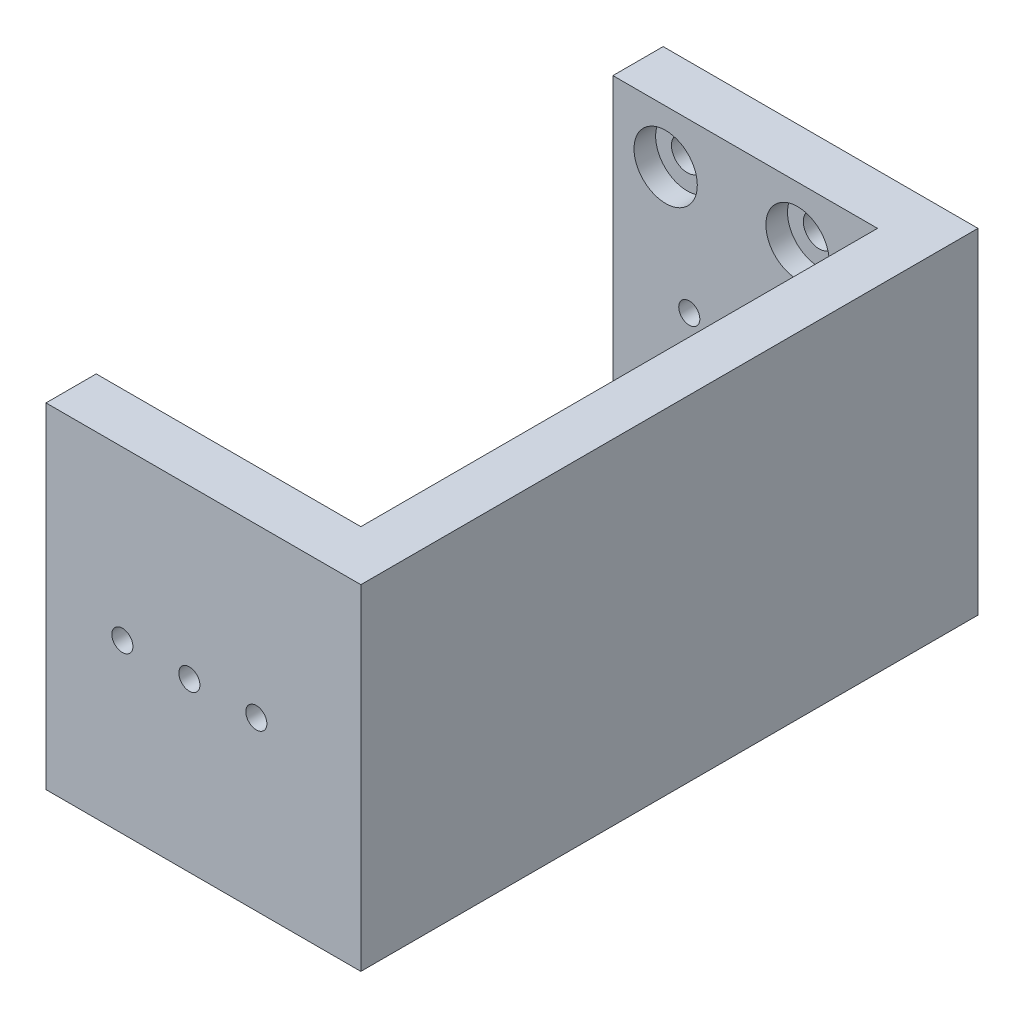
ISO-10303-21;
HEADER;
FILE_DESCRIPTION(('STEP AP214'),'2;1');
FILE_NAME('part.step','',(''),(''),'','','');
FILE_SCHEMA(('AUTOMOTIVE_DESIGN { 1 0 10303 214 1 1 1 1 }'));
ENDSEC;
DATA;
#1=APPLICATION_CONTEXT('core data for automotive mechanical design processes');
#2=APPLICATION_PROTOCOL_DEFINITION('international standard','automotive_design',2000,#1);
#3=PRODUCT_CONTEXT('',#1,'mechanical');
#4=PRODUCT('Part','Part','',(#3));
#5=PRODUCT_RELATED_PRODUCT_CATEGORY('part','',(#4));
#6=PRODUCT_DEFINITION_FORMATION('','',#4);
#7=PRODUCT_DEFINITION_CONTEXT('part definition',#1,'design');
#8=PRODUCT_DEFINITION('design','',#6,#7);
#9=PRODUCT_DEFINITION_SHAPE('','',#8);
#10=(LENGTH_UNIT() NAMED_UNIT(*) SI_UNIT(.MILLI.,.METRE.));
#11=(NAMED_UNIT(*) PLANE_ANGLE_UNIT() SI_UNIT($,.RADIAN.));
#12=(NAMED_UNIT(*) SI_UNIT($,.STERADIAN.) SOLID_ANGLE_UNIT());
#13=UNCERTAINTY_MEASURE_WITH_UNIT(LENGTH_MEASURE(1.E-05),#10,'distance_accuracy_value','');
#14=(GEOMETRIC_REPRESENTATION_CONTEXT(3) GLOBAL_UNCERTAINTY_ASSIGNED_CONTEXT((#13)) GLOBAL_UNIT_ASSIGNED_CONTEXT((#10,
#11,#12)) REPRESENTATION_CONTEXT('',''));
#15=CARTESIAN_POINT('',(0.,0.,0.));
#16=DIRECTION('',(0.,0.,1.));
#17=DIRECTION('',(1.,0.,0.));
#18=AXIS2_PLACEMENT_3D('',#15,#16,#17);
#19=CARTESIAN_POINT('',(-27.178,31.75,117.));
#20=DIRECTION('',(1.,0.,0.));
#21=DIRECTION('',(0.,0.,-1.));
#22=AXIS2_PLACEMENT_3D('',#19,#20,#21);
#23=PLANE('',#22);
#24=DIRECTION('',(0.,0.,-1.));
#25=VECTOR('',#24,1.);
#26=CARTESIAN_POINT('',(-27.178,31.75,117.));
#27=LINE('',#26,#25);
#28=CARTESIAN_POINT('',(-27.178,31.75,117.));
#29=VERTEX_POINT('',#28);
#30=CARTESIAN_POINT('',(-27.178,31.75,107.475));
#31=VERTEX_POINT('',#30);
#32=EDGE_CURVE('E127',#29,#31,#27,.T.);
#33=ORIENTED_EDGE('',*,*,#32,.T.);
#34=DIRECTION('',(0.,-1.,0.));
#35=VECTOR('',#34,1.);
#36=CARTESIAN_POINT('',(-27.178,31.75,107.475));
#37=LINE('',#36,#35);
#38=CARTESIAN_POINT('',(-27.178,-31.75,107.475));
#39=VERTEX_POINT('',#38);
#40=EDGE_CURVE('E142',#31,#39,#37,.T.);
#41=ORIENTED_EDGE('',*,*,#40,.T.);
#42=DIRECTION('',(0.,0.,-1.));
#43=VECTOR('',#42,1.);
#44=CARTESIAN_POINT('',(-27.178,-31.75,117.));
#45=LINE('',#44,#43);
#46=CARTESIAN_POINT('',(-27.178,-31.75,117.));
#47=VERTEX_POINT('',#46);
#48=EDGE_CURVE('E11',#47,#39,#45,.T.);
#49=ORIENTED_EDGE('',*,*,#48,.F.);
#50=DIRECTION('',(0.,-1.,0.));
#51=VECTOR('',#50,1.);
#52=CARTESIAN_POINT('',(-27.178,31.75,117.));
#53=LINE('',#52,#51);
#54=EDGE_CURVE('E185',#29,#47,#53,.T.);
#55=ORIENTED_EDGE('',*,*,#54,.F.);
#56=EDGE_LOOP('',(#33,#41,#49,#55));
#57=FACE_BOUND('',#56,.T.);
#58=ADVANCED_FACE('F34',(#57),#23,.F.);
#59=CARTESIAN_POINT('',(-12.7,0.,117.));
#60=DIRECTION('',(0.,0.,-1.));
#61=DIRECTION('',(-1.,0.,0.));
#62=AXIS2_PLACEMENT_3D('',#59,#60,#61);
#63=CYLINDRICAL_SURFACE('',#62,2.);
#64=CARTESIAN_POINT('',(-12.7,0.,107.475));
#65=DIRECTION('',(0.,0.,1.));
#66=DIRECTION('',(1.,0.,0.));
#67=AXIS2_PLACEMENT_3D('',#64,#65,#66);
#68=CIRCLE('',#67,2.);
#69=CARTESIAN_POINT('',(-10.7,0.,107.475));
#70=VERTEX_POINT('',#69);
#71=EDGE_CURVE('E163',#70,#70,#68,.T.);
#72=ORIENTED_EDGE('',*,*,#71,.F.);
#73=EDGE_LOOP('',(#72));
#74=FACE_BOUND('',#73,.T.);
#75=CARTESIAN_POINT('',(-12.7,0.,117.));
#76=DIRECTION('',(0.,0.,1.));
#77=DIRECTION('',(1.,0.,0.));
#78=AXIS2_PLACEMENT_3D('',#75,#76,#77);
#79=CIRCLE('',#78,2.);
#80=CARTESIAN_POINT('',(-10.7,0.,117.));
#81=VERTEX_POINT('',#80);
#82=EDGE_CURVE('E179',#81,#81,#79,.T.);
#83=ORIENTED_EDGE('',*,*,#82,.T.);
#84=EDGE_LOOP('',(#83));
#85=FACE_BOUND('',#84,.T.);
#86=ADVANCED_FACE('F275',(#74,#85),#63,.F.);
#87=CARTESIAN_POINT('',(0.,0.,117.));
#88=DIRECTION('',(0.,0.,-1.));
#89=DIRECTION('',(-1.,0.,0.));
#90=AXIS2_PLACEMENT_3D('',#87,#88,#89);
#91=CYLINDRICAL_SURFACE('',#90,2.);
#92=CARTESIAN_POINT('',(0.,0.,107.475));
#93=DIRECTION('',(0.,0.,1.));
#94=DIRECTION('',(1.,0.,0.));
#95=AXIS2_PLACEMENT_3D('',#92,#93,#94);
#96=CIRCLE('',#95,2.);
#97=CARTESIAN_POINT('',(2.,0.,107.475));
#98=VERTEX_POINT('',#97);
#99=EDGE_CURVE('E160',#98,#98,#96,.T.);
#100=ORIENTED_EDGE('',*,*,#99,.F.);
#101=EDGE_LOOP('',(#100));
#102=FACE_BOUND('',#101,.T.);
#103=CARTESIAN_POINT('',(0.,0.,117.));
#104=DIRECTION('',(0.,0.,1.));
#105=DIRECTION('',(1.,0.,0.));
#106=AXIS2_PLACEMENT_3D('',#103,#104,#105);
#107=CIRCLE('',#106,2.);
#108=CARTESIAN_POINT('',(2.,0.,117.));
#109=VERTEX_POINT('',#108);
#110=EDGE_CURVE('E173',#109,#109,#107,.T.);
#111=ORIENTED_EDGE('',*,*,#110,.T.);
#112=EDGE_LOOP('',(#111));
#113=FACE_BOUND('',#112,.T.);
#114=ADVANCED_FACE('F279',(#102,#113),#91,.F.);
#115=CARTESIAN_POINT('',(12.7,0.,117.));
#116=DIRECTION('',(0.,0.,-1.));
#117=DIRECTION('',(-1.,0.,0.));
#118=AXIS2_PLACEMENT_3D('',#115,#116,#117);
#119=CYLINDRICAL_SURFACE('',#118,2.);
#120=CARTESIAN_POINT('',(12.7,0.,107.475));
#121=DIRECTION('',(0.,0.,1.));
#122=DIRECTION('',(1.,0.,0.));
#123=AXIS2_PLACEMENT_3D('',#120,#121,#122);
#124=CIRCLE('',#123,2.);
#125=CARTESIAN_POINT('',(14.7,0.,107.475));
#126=VERTEX_POINT('',#125);
#127=EDGE_CURVE('E38',#126,#126,#124,.T.);
#128=ORIENTED_EDGE('',*,*,#127,.F.);
#129=EDGE_LOOP('',(#128));
#130=FACE_BOUND('',#129,.T.);
#131=CARTESIAN_POINT('',(12.7,0.,117.));
#132=DIRECTION('',(0.,0.,1.));
#133=DIRECTION('',(1.,0.,0.));
#134=AXIS2_PLACEMENT_3D('',#131,#132,#133);
#135=CIRCLE('',#134,2.);
#136=CARTESIAN_POINT('',(14.7,0.,117.));
#137=VERTEX_POINT('',#136);
#138=EDGE_CURVE('E167',#137,#137,#135,.T.);
#139=ORIENTED_EDGE('',*,*,#138,.T.);
#140=EDGE_LOOP('',(#139));
#141=FACE_BOUND('',#140,.T.);
#142=ADVANCED_FACE('F295',(#130,#141),#119,.F.);
#143=CARTESIAN_POINT('',(-27.178,-31.75,117.));
#144=DIRECTION('',(0.,0.,1.));
#145=DIRECTION('',(1.,0.,0.));
#146=AXIS2_PLACEMENT_3D('',#143,#144,#145);
#147=PLANE('',#146);
#148=ORIENTED_EDGE('',*,*,#110,.F.);
#149=EDGE_LOOP('',(#148));
#150=FACE_BOUND('',#149,.T.);
#151=ORIENTED_EDGE('',*,*,#54,.T.);
#152=DIRECTION('',(1.,0.,0.));
#153=VECTOR('',#152,1.);
#154=CARTESIAN_POINT('',(-27.178,-31.75,117.));
#155=LINE('',#154,#153);
#156=CARTESIAN_POINT('',(32.512,-31.75,117.));
#157=VERTEX_POINT('',#156);
#158=EDGE_CURVE('E89',#47,#157,#155,.T.);
#159=ORIENTED_EDGE('',*,*,#158,.T.);
#160=DIRECTION('',(0.,1.,0.));
#161=VECTOR('',#160,1.);
#162=CARTESIAN_POINT('',(32.512,-31.75,117.));
#163=LINE('',#162,#161);
#164=CARTESIAN_POINT('',(32.512,31.75,117.));
#165=VERTEX_POINT('',#164);
#166=EDGE_CURVE('E131',#157,#165,#163,.T.);
#167=ORIENTED_EDGE('',*,*,#166,.T.);
#168=DIRECTION('',(-1.,0.,0.));
#169=VECTOR('',#168,1.);
#170=CARTESIAN_POINT('',(32.512,31.75,117.));
#171=LINE('',#170,#169);
#172=EDGE_CURVE('E60',#165,#29,#171,.T.);
#173=ORIENTED_EDGE('',*,*,#172,.T.);
#174=EDGE_LOOP('',(#151,#159,#167,#173));
#175=FACE_BOUND('',#174,.T.);
#176=ORIENTED_EDGE('',*,*,#82,.F.);
#177=EDGE_LOOP('',(#176));
#178=FACE_BOUND('',#177,.T.);
#179=ORIENTED_EDGE('',*,*,#138,.F.);
#180=EDGE_LOOP('',(#179));
#181=FACE_BOUND('',#180,.T.);
#182=ADVANCED_FACE('F289',(#150,#175,#178,#181),#147,.T.);
#183=CARTESIAN_POINT('',(-27.178,-31.75,0.));
#184=DIRECTION('',(0.,0.,1.));
#185=DIRECTION('',(1.,0.,0.));
#186=AXIS2_PLACEMENT_3D('',#183,#184,#185);
#187=PLANE('',#186);
#188=CARTESIAN_POINT('',(-17.178,-21.75,0.));
#189=DIRECTION('',(0.,0.,1.));
#190=DIRECTION('',(1.,0.,0.));
#191=AXIS2_PLACEMENT_3D('',#188,#189,#190);
#192=CIRCLE('',#191,3.00000000000006);
#193=CARTESIAN_POINT('',(-14.1779999999999,-21.75,0.));
#194=VERTEX_POINT('',#193);
#195=EDGE_CURVE('E257',#194,#194,#192,.T.);
#196=ORIENTED_EDGE('',*,*,#195,.T.);
#197=EDGE_LOOP('',(#196));
#198=FACE_BOUND('',#197,.T.);
#199=CARTESIAN_POINT('',(7.82200000000003,-21.75,0.));
#200=DIRECTION('',(0.,0.,1.));
#201=DIRECTION('',(1.,0.,0.));
#202=AXIS2_PLACEMENT_3D('',#199,#200,#201);
#203=CIRCLE('',#202,3.00000000000005);
#204=CARTESIAN_POINT('',(10.8220000000001,-21.75,0.));
#205=VERTEX_POINT('',#204);
#206=EDGE_CURVE('E251',#205,#205,#203,.T.);
#207=ORIENTED_EDGE('',*,*,#206,.T.);
#208=EDGE_LOOP('',(#207));
#209=FACE_BOUND('',#208,.T.);
#210=CARTESIAN_POINT('',(7.82200000000003,21.75,0.));
#211=DIRECTION('',(0.,0.,1.));
#212=DIRECTION('',(1.,0.,0.));
#213=AXIS2_PLACEMENT_3D('',#210,#211,#212);
#214=CIRCLE('',#213,3.00000000000005);
#215=CARTESIAN_POINT('',(10.8220000000001,21.75,0.));
#216=VERTEX_POINT('',#215);
#217=EDGE_CURVE('E245',#216,#216,#214,.T.);
#218=ORIENTED_EDGE('',*,*,#217,.T.);
#219=EDGE_LOOP('',(#218));
#220=FACE_BOUND('',#219,.T.);
#221=CARTESIAN_POINT('',(-17.178,21.75,0.));
#222=DIRECTION('',(0.,0.,1.));
#223=DIRECTION('',(1.,0.,0.));
#224=AXIS2_PLACEMENT_3D('',#221,#222,#223);
#225=CIRCLE('',#224,3.00000000000006);
#226=CARTESIAN_POINT('',(-14.1779999999999,21.75,0.));
#227=VERTEX_POINT('',#226);
#228=EDGE_CURVE('E239',#227,#227,#225,.T.);
#229=ORIENTED_EDGE('',*,*,#228,.T.);
#230=EDGE_LOOP('',(#229));
#231=FACE_BOUND('',#230,.T.);
#232=CARTESIAN_POINT('',(0.,0.,0.));
#233=DIRECTION('',(0.,0.,1.));
#234=DIRECTION('',(1.,0.,0.));
#235=AXIS2_PLACEMENT_3D('',#232,#233,#234);
#236=CIRCLE('',#235,2.);
#237=CARTESIAN_POINT('',(2.,0.,0.));
#238=VERTEX_POINT('',#237);
#239=EDGE_CURVE('E170',#238,#238,#236,.T.);
#240=ORIENTED_EDGE('',*,*,#239,.T.);
#241=EDGE_LOOP('',(#240));
#242=FACE_BOUND('',#241,.T.);
#243=DIRECTION('',(0.,-1.,0.));
#244=VECTOR('',#243,1.);
#245=CARTESIAN_POINT('',(-27.178,31.75,0.));
#246=LINE('',#245,#244);
#247=CARTESIAN_POINT('',(-27.178,31.75,0.));
#248=VERTEX_POINT('',#247);
#249=CARTESIAN_POINT('',(-27.178,-31.75,0.));
#250=VERTEX_POINT('',#249);
#251=EDGE_CURVE('E182',#248,#250,#246,.T.);
#252=ORIENTED_EDGE('',*,*,#251,.F.);
#253=DIRECTION('',(-1.,0.,0.));
#254=VECTOR('',#253,1.);
#255=CARTESIAN_POINT('',(32.512,31.75,0.));
#256=LINE('',#255,#254);
#257=CARTESIAN_POINT('',(32.512,31.75,0.));
#258=VERTEX_POINT('',#257);
#259=EDGE_CURVE('E125',#258,#248,#256,.T.);
#260=ORIENTED_EDGE('',*,*,#259,.F.);
#261=DIRECTION('',(0.,1.,0.));
#262=VECTOR('',#261,1.);
#263=CARTESIAN_POINT('',(32.512,-31.75,0.));
#264=LINE('',#263,#262);
#265=CARTESIAN_POINT('',(32.512,-31.75,0.));
#266=VERTEX_POINT('',#265);
#267=EDGE_CURVE('E191',#266,#258,#264,.T.);
#268=ORIENTED_EDGE('',*,*,#267,.F.);
#269=DIRECTION('',(1.,0.,0.));
#270=VECTOR('',#269,1.);
#271=CARTESIAN_POINT('',(-27.178,-31.75,0.));
#272=LINE('',#271,#270);
#273=EDGE_CURVE('E190',#250,#266,#272,.T.);
#274=ORIENTED_EDGE('',*,*,#273,.F.);
#275=EDGE_LOOP('',(#252,#260,#268,#274));
#276=FACE_BOUND('',#275,.T.);
#277=CARTESIAN_POINT('',(-12.7,0.,0.));
#278=DIRECTION('',(0.,0.,1.));
#279=DIRECTION('',(1.,0.,0.));
#280=AXIS2_PLACEMENT_3D('',#277,#278,#279);
#281=CIRCLE('',#280,2.);
#282=CARTESIAN_POINT('',(-10.7,0.,0.));
#283=VERTEX_POINT('',#282);
#284=EDGE_CURVE('E176',#283,#283,#281,.T.);
#285=ORIENTED_EDGE('',*,*,#284,.T.);
#286=EDGE_LOOP('',(#285));
#287=FACE_BOUND('',#286,.T.);
#288=CARTESIAN_POINT('',(12.7,0.,0.));
#289=DIRECTION('',(0.,0.,1.));
#290=DIRECTION('',(1.,0.,0.));
#291=AXIS2_PLACEMENT_3D('',#288,#289,#290);
#292=CIRCLE('',#291,2.);
#293=CARTESIAN_POINT('',(14.7,0.,0.));
#294=VERTEX_POINT('',#293);
#295=EDGE_CURVE('E166',#294,#294,#292,.T.);
#296=ORIENTED_EDGE('',*,*,#295,.T.);
#297=EDGE_LOOP('',(#296));
#298=FACE_BOUND('',#297,.T.);
#299=ADVANCED_FACE('F199',(#198,#209,#220,#231,#242,#276,#287,#298),#187,.F.);
#300=CARTESIAN_POINT('',(-27.178,-31.75,9.52500000000001));
#301=VERTEX_POINT('',#300);
#302=EDGE_CURVE('E43',#301,#250,#45,.T.);
#303=ORIENTED_EDGE('',*,*,#302,.F.);
#304=DIRECTION('',(0.,-1.,0.));
#305=VECTOR('',#304,1.);
#306=CARTESIAN_POINT('',(-27.178,31.75,9.52500000000001));
#307=LINE('',#306,#305);
#308=CARTESIAN_POINT('',(-27.178,31.75,9.52500000000001));
#309=VERTEX_POINT('',#308);
#310=EDGE_CURVE('E113',#309,#301,#307,.T.);
#311=ORIENTED_EDGE('',*,*,#310,.F.);
#312=EDGE_CURVE('E82',#309,#248,#27,.T.);
#313=ORIENTED_EDGE('',*,*,#312,.T.);
#314=ORIENTED_EDGE('',*,*,#251,.T.);
#315=EDGE_LOOP('',(#303,#311,#313,#314));
#316=FACE_BOUND('',#315,.T.);
#317=ADVANCED_FACE('F36',(#316),#23,.F.);
#318=CARTESIAN_POINT('',(-27.178,-31.75,117.));
#319=DIRECTION('',(0.,1.,0.));
#320=DIRECTION('',(0.,0.,1.));
#321=AXIS2_PLACEMENT_3D('',#318,#319,#320);
#322=PLANE('',#321);
#323=ORIENTED_EDGE('',*,*,#48,.T.);
#324=DIRECTION('',(-1.,0.,0.));
#325=VECTOR('',#324,1.);
#326=CARTESIAN_POINT('',(-27.178,-31.75,107.475));
#327=LINE('',#326,#325);
#328=CARTESIAN_POINT('',(22.987,-31.75,107.475));
#329=VERTEX_POINT('',#328);
#330=EDGE_CURVE('E117',#329,#39,#327,.T.);
#331=ORIENTED_EDGE('',*,*,#330,.F.);
#332=DIRECTION('',(0.,0.,1.));
#333=VECTOR('',#332,1.);
#334=CARTESIAN_POINT('',(22.987,-31.75,107.475));
#335=LINE('',#334,#333);
#336=CARTESIAN_POINT('',(22.987,-31.75,9.525));
#337=VERTEX_POINT('',#336);
#338=EDGE_CURVE('E206',#337,#329,#335,.T.);
#339=ORIENTED_EDGE('',*,*,#338,.F.);
#340=DIRECTION('',(1.,0.,0.));
#341=VECTOR('',#340,1.);
#342=CARTESIAN_POINT('',(-27.178,-31.75,9.52500000000001));
#343=LINE('',#342,#341);
#344=EDGE_CURVE('E203',#301,#337,#343,.T.);
#345=ORIENTED_EDGE('',*,*,#344,.F.);
#346=ORIENTED_EDGE('',*,*,#302,.T.);
#347=ORIENTED_EDGE('',*,*,#273,.T.);
#348=DIRECTION('',(0.,0.,-1.));
#349=VECTOR('',#348,1.);
#350=CARTESIAN_POINT('',(32.512,-31.75,117.));
#351=LINE('',#350,#349);
#352=EDGE_CURVE('E137',#157,#266,#351,.T.);
#353=ORIENTED_EDGE('',*,*,#352,.F.);
#354=ORIENTED_EDGE('',*,*,#158,.F.);
#355=EDGE_LOOP('',(#323,#331,#339,#345,#346,#347,#353,#354));
#356=FACE_BOUND('',#355,.T.);
#357=ADVANCED_FACE('F201',(#356),#322,.F.);
#358=CARTESIAN_POINT('',(32.512,-31.75,117.));
#359=DIRECTION('',(-1.,0.,0.));
#360=DIRECTION('',(0.,0.,1.));
#361=AXIS2_PLACEMENT_3D('',#358,#359,#360);
#362=PLANE('',#361);
#363=ORIENTED_EDGE('',*,*,#267,.T.);
#364=DIRECTION('',(0.,0.,-1.));
#365=VECTOR('',#364,1.);
#366=CARTESIAN_POINT('',(32.512,31.75,117.));
#367=LINE('',#366,#365);
#368=EDGE_CURVE('E130',#165,#258,#367,.T.);
#369=ORIENTED_EDGE('',*,*,#368,.F.);
#370=ORIENTED_EDGE('',*,*,#166,.F.);
#371=ORIENTED_EDGE('',*,*,#352,.T.);
#372=EDGE_LOOP('',(#363,#369,#370,#371));
#373=FACE_BOUND('',#372,.T.);
#374=ADVANCED_FACE('F195',(#373),#362,.F.);
#375=CARTESIAN_POINT('',(32.512,31.75,117.));
#376=DIRECTION('',(0.,-1.,0.));
#377=DIRECTION('',(0.,0.,-1.));
#378=AXIS2_PLACEMENT_3D('',#375,#376,#377);
#379=PLANE('',#378);
#380=DIRECTION('',(0.,0.,1.));
#381=VECTOR('',#380,1.);
#382=CARTESIAN_POINT('',(22.987,31.75,107.475));
#383=LINE('',#382,#381);
#384=CARTESIAN_POINT('',(22.987,31.75,9.52500000000001));
#385=VERTEX_POINT('',#384);
#386=CARTESIAN_POINT('',(22.987,31.75,107.475));
#387=VERTEX_POINT('',#386);
#388=EDGE_CURVE('E51',#385,#387,#383,.T.);
#389=ORIENTED_EDGE('',*,*,#388,.T.);
#390=DIRECTION('',(-1.,0.,0.));
#391=VECTOR('',#390,1.);
#392=CARTESIAN_POINT('',(-27.178,31.75,107.475));
#393=LINE('',#392,#391);
#394=EDGE_CURVE('E120',#387,#31,#393,.T.);
#395=ORIENTED_EDGE('',*,*,#394,.T.);
#396=ORIENTED_EDGE('',*,*,#32,.F.);
#397=ORIENTED_EDGE('',*,*,#172,.F.);
#398=ORIENTED_EDGE('',*,*,#368,.T.);
#399=ORIENTED_EDGE('',*,*,#259,.T.);
#400=ORIENTED_EDGE('',*,*,#312,.F.);
#401=DIRECTION('',(1.,0.,0.));
#402=VECTOR('',#401,1.);
#403=CARTESIAN_POINT('',(-27.178,31.75,9.52500000000001));
#404=LINE('',#403,#402);
#405=EDGE_CURVE('E110',#309,#385,#404,.T.);
#406=ORIENTED_EDGE('',*,*,#405,.T.);
#407=EDGE_LOOP('',(#389,#395,#396,#397,#398,#399,#400,#406));
#408=FACE_BOUND('',#407,.T.);
#409=ADVANCED_FACE('F122',(#408),#379,.F.);
#410=CARTESIAN_POINT('',(-12.7,0.,9.52500000000001));
#411=DIRECTION('',(0.,0.,-1.));
#412=DIRECTION('',(-1.,0.,0.));
#413=AXIS2_PLACEMENT_3D('',#410,#411,#412);
#414=CIRCLE('',#413,2.);
#415=CARTESIAN_POINT('',(-14.7,0.,9.52500000000001));
#416=VERTEX_POINT('',#415);
#417=EDGE_CURVE('E146',#416,#416,#414,.T.);
#418=ORIENTED_EDGE('',*,*,#417,.F.);
#419=EDGE_LOOP('',(#418));
#420=FACE_BOUND('',#419,.T.);
#421=ORIENTED_EDGE('',*,*,#284,.F.);
#422=EDGE_LOOP('',(#421));
#423=FACE_BOUND('',#422,.T.);
#424=ADVANCED_FACE('F282',(#420,#423),#63,.F.);
#425=CARTESIAN_POINT('',(0.,0.,9.52500000000001));
#426=DIRECTION('',(0.,0.,-1.));
#427=DIRECTION('',(-1.,0.,0.));
#428=AXIS2_PLACEMENT_3D('',#425,#426,#427);
#429=CIRCLE('',#428,2.);
#430=CARTESIAN_POINT('',(-2.,0.,9.52500000000001));
#431=VERTEX_POINT('',#430);
#432=EDGE_CURVE('E141',#431,#431,#429,.T.);
#433=ORIENTED_EDGE('',*,*,#432,.F.);
#434=EDGE_LOOP('',(#433));
#435=FACE_BOUND('',#434,.T.);
#436=ORIENTED_EDGE('',*,*,#239,.F.);
#437=EDGE_LOOP('',(#436));
#438=FACE_BOUND('',#437,.T.);
#439=ADVANCED_FACE('F317',(#435,#438),#91,.F.);
#440=CARTESIAN_POINT('',(12.7,0.,9.52500000000001));
#441=DIRECTION('',(0.,0.,-1.));
#442=DIRECTION('',(-1.,0.,0.));
#443=AXIS2_PLACEMENT_3D('',#440,#441,#442);
#444=CIRCLE('',#443,2.);
#445=CARTESIAN_POINT('',(10.7,0.,9.52500000000001));
#446=VERTEX_POINT('',#445);
#447=EDGE_CURVE('E139',#446,#446,#444,.T.);
#448=ORIENTED_EDGE('',*,*,#447,.F.);
#449=EDGE_LOOP('',(#448));
#450=FACE_BOUND('',#449,.T.);
#451=ORIENTED_EDGE('',*,*,#295,.F.);
#452=EDGE_LOOP('',(#451));
#453=FACE_BOUND('',#452,.T.);
#454=ADVANCED_FACE('F324',(#450,#453),#119,.F.);
#455=CARTESIAN_POINT('',(-27.178,31.75,107.475));
#456=DIRECTION('',(0.,0.,1.));
#457=DIRECTION('',(1.,0.,0.));
#458=AXIS2_PLACEMENT_3D('',#455,#456,#457);
#459=PLANE('',#458);
#460=ORIENTED_EDGE('',*,*,#71,.T.);
#461=EDGE_LOOP('',(#460));
#462=FACE_BOUND('',#461,.T.);
#463=ORIENTED_EDGE('',*,*,#99,.T.);
#464=EDGE_LOOP('',(#463));
#465=FACE_BOUND('',#464,.T.);
#466=ORIENTED_EDGE('',*,*,#127,.T.);
#467=EDGE_LOOP('',(#466));
#468=FACE_BOUND('',#467,.T.);
#469=ORIENTED_EDGE('',*,*,#330,.T.);
#470=ORIENTED_EDGE('',*,*,#40,.F.);
#471=ORIENTED_EDGE('',*,*,#394,.F.);
#472=DIRECTION('',(0.,-1.,0.));
#473=VECTOR('',#472,1.);
#474=CARTESIAN_POINT('',(22.987,31.75,107.475));
#475=LINE('',#474,#473);
#476=EDGE_CURVE('E149',#387,#329,#475,.T.);
#477=ORIENTED_EDGE('',*,*,#476,.T.);
#478=EDGE_LOOP('',(#469,#470,#471,#477));
#479=FACE_BOUND('',#478,.T.);
#480=ADVANCED_FACE('F332',(#462,#465,#468,#479),#459,.F.);
#481=CARTESIAN_POINT('',(22.987,31.75,107.475));
#482=DIRECTION('',(1.,0.,0.));
#483=DIRECTION('',(0.,0.,-1.));
#484=AXIS2_PLACEMENT_3D('',#481,#482,#483);
#485=PLANE('',#484);
#486=ORIENTED_EDGE('',*,*,#338,.T.);
#487=ORIENTED_EDGE('',*,*,#476,.F.);
#488=ORIENTED_EDGE('',*,*,#388,.F.);
#489=DIRECTION('',(0.,-1.,0.));
#490=VECTOR('',#489,1.);
#491=CARTESIAN_POINT('',(22.987,31.75,9.525));
#492=LINE('',#491,#490);
#493=EDGE_CURVE('E115',#385,#337,#492,.T.);
#494=ORIENTED_EDGE('',*,*,#493,.T.);
#495=EDGE_LOOP('',(#486,#487,#488,#494));
#496=FACE_BOUND('',#495,.T.);
#497=ADVANCED_FACE('F340',(#496),#485,.F.);
#498=CARTESIAN_POINT('',(-27.178,31.75,9.52500000000001));
#499=DIRECTION('',(0.,0.,-1.));
#500=DIRECTION('',(-1.,0.,0.));
#501=AXIS2_PLACEMENT_3D('',#498,#499,#500);
#502=PLANE('',#501);
#503=CARTESIAN_POINT('',(7.82200000000003,21.75,9.525));
#504=DIRECTION('',(0.,0.,1.));
#505=DIRECTION('',(1.,0.,0.));
#506=AXIS2_PLACEMENT_3D('',#503,#504,#505);
#507=CIRCLE('',#506,5.99999999999998);
#508=CARTESIAN_POINT('',(13.822,21.75,9.525));
#509=VERTEX_POINT('',#508);
#510=EDGE_CURVE('E231',#509,#509,#507,.T.);
#511=ORIENTED_EDGE('',*,*,#510,.F.);
#512=EDGE_LOOP('',(#511));
#513=FACE_BOUND('',#512,.T.);
#514=CARTESIAN_POINT('',(-17.178,21.75,9.525));
#515=DIRECTION('',(0.,0.,1.));
#516=DIRECTION('',(1.,0.,0.));
#517=AXIS2_PLACEMENT_3D('',#514,#515,#516);
#518=CIRCLE('',#517,5.99999999999999);
#519=CARTESIAN_POINT('',(-11.178,21.75,9.525));
#520=VERTEX_POINT('',#519);
#521=EDGE_CURVE('E225',#520,#520,#518,.T.);
#522=ORIENTED_EDGE('',*,*,#521,.F.);
#523=EDGE_LOOP('',(#522));
#524=FACE_BOUND('',#523,.T.);
#525=CARTESIAN_POINT('',(7.82200000000003,-21.75,9.525));
#526=DIRECTION('',(0.,0.,1.));
#527=DIRECTION('',(1.,0.,0.));
#528=AXIS2_PLACEMENT_3D('',#525,#526,#527);
#529=CIRCLE('',#528,5.99999999999998);
#530=CARTESIAN_POINT('',(13.822,-21.75,9.525));
#531=VERTEX_POINT('',#530);
#532=EDGE_CURVE('E219',#531,#531,#529,.T.);
#533=ORIENTED_EDGE('',*,*,#532,.F.);
#534=EDGE_LOOP('',(#533));
#535=FACE_BOUND('',#534,.T.);
#536=CARTESIAN_POINT('',(-17.178,-21.75,9.525));
#537=DIRECTION('',(0.,0.,1.));
#538=DIRECTION('',(1.,0.,0.));
#539=AXIS2_PLACEMENT_3D('',#536,#537,#538);
#540=CIRCLE('',#539,5.99999999999999);
#541=CARTESIAN_POINT('',(-11.178,-21.75,9.525));
#542=VERTEX_POINT('',#541);
#543=EDGE_CURVE('E210',#542,#542,#540,.T.);
#544=ORIENTED_EDGE('',*,*,#543,.F.);
#545=EDGE_LOOP('',(#544));
#546=FACE_BOUND('',#545,.T.);
#547=ORIENTED_EDGE('',*,*,#417,.T.);
#548=EDGE_LOOP('',(#547));
#549=FACE_BOUND('',#548,.T.);
#550=ORIENTED_EDGE('',*,*,#432,.T.);
#551=EDGE_LOOP('',(#550));
#552=FACE_BOUND('',#551,.T.);
#553=ORIENTED_EDGE('',*,*,#447,.T.);
#554=EDGE_LOOP('',(#553));
#555=FACE_BOUND('',#554,.T.);
#556=ORIENTED_EDGE('',*,*,#344,.T.);
#557=ORIENTED_EDGE('',*,*,#493,.F.);
#558=ORIENTED_EDGE('',*,*,#405,.F.);
#559=ORIENTED_EDGE('',*,*,#310,.T.);
#560=EDGE_LOOP('',(#556,#557,#558,#559));
#561=FACE_BOUND('',#560,.T.);
#562=ADVANCED_FACE('F112',(#513,#524,#535,#546,#549,#552,#555,#561),#502,.F.);
#563=CARTESIAN_POINT('',(-17.178,-21.75,5.425));
#564=DIRECTION('',(0.,0.,1.));
#565=DIRECTION('',(1.,0.,0.));
#566=AXIS2_PLACEMENT_3D('',#563,#564,#565);
#567=CYLINDRICAL_SURFACE('',#566,5.99999999999999);
#568=CARTESIAN_POINT('',(-17.178,-21.75,5.425));
#569=DIRECTION('',(0.,0.,1.));
#570=DIRECTION('',(1.,0.,0.));
#571=AXIS2_PLACEMENT_3D('',#568,#569,#570);
#572=CIRCLE('',#571,5.99999999999999);
#573=CARTESIAN_POINT('',(-11.178,-21.75,5.425));
#574=VERTEX_POINT('',#573);
#575=EDGE_CURVE('E207',#574,#574,#572,.T.);
#576=ORIENTED_EDGE('',*,*,#575,.F.);
#577=EDGE_LOOP('',(#576));
#578=FACE_BOUND('',#577,.T.);
#579=ORIENTED_EDGE('',*,*,#543,.T.);
#580=EDGE_LOOP('',(#579));
#581=FACE_BOUND('',#580,.T.);
#582=ADVANCED_FACE('F355',(#578,#581),#567,.F.);
#583=CARTESIAN_POINT('',(-17.178,-21.75,5.425));
#584=DIRECTION('',(0.,0.,1.));
#585=DIRECTION('',(1.,0.,0.));
#586=AXIS2_PLACEMENT_3D('',#583,#584,#585);
#587=PLANE('',#586);
#588=CARTESIAN_POINT('',(-17.178,-21.75,5.425));
#589=DIRECTION('',(0.,0.,1.));
#590=DIRECTION('',(1.,0.,0.));
#591=AXIS2_PLACEMENT_3D('',#588,#589,#590);
#592=CIRCLE('',#591,3.00000000000006);
#593=CARTESIAN_POINT('',(-14.1779999999999,-21.75,5.425));
#594=VERTEX_POINT('',#593);
#595=EDGE_CURVE('E254',#594,#594,#592,.T.);
#596=ORIENTED_EDGE('',*,*,#595,.F.);
#597=EDGE_LOOP('',(#596));
#598=FACE_BOUND('',#597,.T.);
#599=ORIENTED_EDGE('',*,*,#575,.T.);
#600=EDGE_LOOP('',(#599));
#601=FACE_BOUND('',#600,.T.);
#602=ADVANCED_FACE('F365',(#598,#601),#587,.T.);
#603=CARTESIAN_POINT('',(7.82200000000003,-21.75,5.425));
#604=DIRECTION('',(0.,0.,1.));
#605=DIRECTION('',(1.,0.,0.));
#606=AXIS2_PLACEMENT_3D('',#603,#604,#605);
#607=CYLINDRICAL_SURFACE('',#606,5.99999999999998);
#608=CARTESIAN_POINT('',(7.82200000000003,-21.75,5.425));
#609=DIRECTION('',(0.,0.,1.));
#610=DIRECTION('',(1.,0.,0.));
#611=AXIS2_PLACEMENT_3D('',#608,#609,#610);
#612=CIRCLE('',#611,5.99999999999998);
#613=CARTESIAN_POINT('',(13.822,-21.75,5.425));
#614=VERTEX_POINT('',#613);
#615=EDGE_CURVE('E217',#614,#614,#612,.T.);
#616=ORIENTED_EDGE('',*,*,#615,.F.);
#617=EDGE_LOOP('',(#616));
#618=FACE_BOUND('',#617,.T.);
#619=ORIENTED_EDGE('',*,*,#532,.T.);
#620=EDGE_LOOP('',(#619));
#621=FACE_BOUND('',#620,.T.);
#622=ADVANCED_FACE('F372',(#618,#621),#607,.F.);
#623=CARTESIAN_POINT('',(7.82200000000003,-21.75,5.425));
#624=DIRECTION('',(0.,0.,1.));
#625=DIRECTION('',(1.,0.,0.));
#626=AXIS2_PLACEMENT_3D('',#623,#624,#625);
#627=PLANE('',#626);
#628=CARTESIAN_POINT('',(7.82200000000003,-21.75,5.425));
#629=DIRECTION('',(0.,0.,1.));
#630=DIRECTION('',(1.,0.,0.));
#631=AXIS2_PLACEMENT_3D('',#628,#629,#630);
#632=CIRCLE('',#631,3.00000000000005);
#633=CARTESIAN_POINT('',(10.8220000000001,-21.75,5.425));
#634=VERTEX_POINT('',#633);
#635=EDGE_CURVE('E248',#634,#634,#632,.T.);
#636=ORIENTED_EDGE('',*,*,#635,.F.);
#637=EDGE_LOOP('',(#636));
#638=FACE_BOUND('',#637,.T.);
#639=ORIENTED_EDGE('',*,*,#615,.T.);
#640=EDGE_LOOP('',(#639));
#641=FACE_BOUND('',#640,.T.);
#642=ADVANCED_FACE('F380',(#638,#641),#627,.T.);
#643=CARTESIAN_POINT('',(-17.178,21.75,5.425));
#644=DIRECTION('',(0.,0.,1.));
#645=DIRECTION('',(1.,0.,0.));
#646=AXIS2_PLACEMENT_3D('',#643,#644,#645);
#647=CYLINDRICAL_SURFACE('',#646,5.99999999999999);
#648=CARTESIAN_POINT('',(-17.178,21.75,5.425));
#649=DIRECTION('',(0.,0.,1.));
#650=DIRECTION('',(1.,0.,0.));
#651=AXIS2_PLACEMENT_3D('',#648,#649,#650);
#652=CIRCLE('',#651,5.99999999999999);
#653=CARTESIAN_POINT('',(-11.178,21.75,5.425));
#654=VERTEX_POINT('',#653);
#655=EDGE_CURVE('E222',#654,#654,#652,.T.);
#656=ORIENTED_EDGE('',*,*,#655,.F.);
#657=EDGE_LOOP('',(#656));
#658=FACE_BOUND('',#657,.T.);
#659=ORIENTED_EDGE('',*,*,#521,.T.);
#660=EDGE_LOOP('',(#659));
#661=FACE_BOUND('',#660,.T.);
#662=ADVANCED_FACE('F388',(#658,#661),#647,.F.);
#663=CARTESIAN_POINT('',(-17.178,21.75,5.425));
#664=DIRECTION('',(0.,0.,1.));
#665=DIRECTION('',(1.,0.,0.));
#666=AXIS2_PLACEMENT_3D('',#663,#664,#665);
#667=PLANE('',#666);
#668=CARTESIAN_POINT('',(-17.178,21.75,5.425));
#669=DIRECTION('',(0.,0.,1.));
#670=DIRECTION('',(1.,0.,0.));
#671=AXIS2_PLACEMENT_3D('',#668,#669,#670);
#672=CIRCLE('',#671,3.00000000000006);
#673=CARTESIAN_POINT('',(-14.1779999999999,21.75,5.425));
#674=VERTEX_POINT('',#673);
#675=EDGE_CURVE('E234',#674,#674,#672,.T.);
#676=ORIENTED_EDGE('',*,*,#675,.F.);
#677=EDGE_LOOP('',(#676));
#678=FACE_BOUND('',#677,.T.);
#679=ORIENTED_EDGE('',*,*,#655,.T.);
#680=EDGE_LOOP('',(#679));
#681=FACE_BOUND('',#680,.T.);
#682=ADVANCED_FACE('F396',(#678,#681),#667,.T.);
#683=CARTESIAN_POINT('',(7.82200000000003,21.75,5.425));
#684=DIRECTION('',(0.,0.,1.));
#685=DIRECTION('',(1.,0.,0.));
#686=AXIS2_PLACEMENT_3D('',#683,#684,#685);
#687=CYLINDRICAL_SURFACE('',#686,5.99999999999998);
#688=CARTESIAN_POINT('',(7.82200000000003,21.75,5.425));
#689=DIRECTION('',(0.,0.,1.));
#690=DIRECTION('',(1.,0.,0.));
#691=AXIS2_PLACEMENT_3D('',#688,#689,#690);
#692=CIRCLE('',#691,5.99999999999998);
#693=CARTESIAN_POINT('',(13.822,21.75,5.425));
#694=VERTEX_POINT('',#693);
#695=EDGE_CURVE('E228',#694,#694,#692,.T.);
#696=ORIENTED_EDGE('',*,*,#695,.F.);
#697=EDGE_LOOP('',(#696));
#698=FACE_BOUND('',#697,.T.);
#699=ORIENTED_EDGE('',*,*,#510,.T.);
#700=EDGE_LOOP('',(#699));
#701=FACE_BOUND('',#700,.T.);
#702=ADVANCED_FACE('F404',(#698,#701),#687,.F.);
#703=CARTESIAN_POINT('',(7.82200000000003,21.75,5.425));
#704=DIRECTION('',(0.,0.,1.));
#705=DIRECTION('',(1.,0.,0.));
#706=AXIS2_PLACEMENT_3D('',#703,#704,#705);
#707=PLANE('',#706);
#708=CARTESIAN_POINT('',(7.82200000000003,21.75,5.425));
#709=DIRECTION('',(0.,0.,1.));
#710=DIRECTION('',(1.,0.,0.));
#711=AXIS2_PLACEMENT_3D('',#708,#709,#710);
#712=CIRCLE('',#711,3.00000000000005);
#713=CARTESIAN_POINT('',(10.8220000000001,21.75,5.425));
#714=VERTEX_POINT('',#713);
#715=EDGE_CURVE('E242',#714,#714,#712,.T.);
#716=ORIENTED_EDGE('',*,*,#715,.F.);
#717=EDGE_LOOP('',(#716));
#718=FACE_BOUND('',#717,.T.);
#719=ORIENTED_EDGE('',*,*,#695,.T.);
#720=EDGE_LOOP('',(#719));
#721=FACE_BOUND('',#720,.T.);
#722=ADVANCED_FACE('F412',(#718,#721),#707,.T.);
#723=CARTESIAN_POINT('',(-17.178,21.75,0.));
#724=DIRECTION('',(0.,0.,1.));
#725=DIRECTION('',(1.,0.,0.));
#726=AXIS2_PLACEMENT_3D('',#723,#724,#725);
#727=CYLINDRICAL_SURFACE('',#726,3.00000000000006);
#728=ORIENTED_EDGE('',*,*,#675,.T.);
#729=EDGE_LOOP('',(#728));
#730=FACE_BOUND('',#729,.T.);
#731=ORIENTED_EDGE('',*,*,#228,.F.);
#732=EDGE_LOOP('',(#731));
#733=FACE_BOUND('',#732,.T.);
#734=ADVANCED_FACE('F419',(#730,#733),#727,.F.);
#735=CARTESIAN_POINT('',(7.82200000000003,21.75,0.));
#736=DIRECTION('',(0.,0.,1.));
#737=DIRECTION('',(1.,0.,0.));
#738=AXIS2_PLACEMENT_3D('',#735,#736,#737);
#739=CYLINDRICAL_SURFACE('',#738,3.00000000000005);
#740=ORIENTED_EDGE('',*,*,#715,.T.);
#741=EDGE_LOOP('',(#740));
#742=FACE_BOUND('',#741,.T.);
#743=ORIENTED_EDGE('',*,*,#217,.F.);
#744=EDGE_LOOP('',(#743));
#745=FACE_BOUND('',#744,.T.);
#746=ADVANCED_FACE('F271',(#742,#745),#739,.F.);
#747=CARTESIAN_POINT('',(7.82200000000003,-21.75,0.));
#748=DIRECTION('',(0.,0.,1.));
#749=DIRECTION('',(1.,0.,0.));
#750=AXIS2_PLACEMENT_3D('',#747,#748,#749);
#751=CYLINDRICAL_SURFACE('',#750,3.00000000000005);
#752=ORIENTED_EDGE('',*,*,#635,.T.);
#753=EDGE_LOOP('',(#752));
#754=FACE_BOUND('',#753,.T.);
#755=ORIENTED_EDGE('',*,*,#206,.F.);
#756=EDGE_LOOP('',(#755));
#757=FACE_BOUND('',#756,.T.);
#758=ADVANCED_FACE('F265',(#754,#757),#751,.F.);
#759=CARTESIAN_POINT('',(-17.178,-21.75,0.));
#760=DIRECTION('',(0.,0.,1.));
#761=DIRECTION('',(1.,0.,0.));
#762=AXIS2_PLACEMENT_3D('',#759,#760,#761);
#763=CYLINDRICAL_SURFACE('',#762,3.00000000000006);
#764=ORIENTED_EDGE('',*,*,#595,.T.);
#765=EDGE_LOOP('',(#764));
#766=FACE_BOUND('',#765,.T.);
#767=ORIENTED_EDGE('',*,*,#195,.F.);
#768=EDGE_LOOP('',(#767));
#769=FACE_BOUND('',#768,.T.);
#770=ADVANCED_FACE('F263',(#766,#769),#763,.F.);
#771=CLOSED_SHELL('',(#58,#86,#114,#142,#182,#299,#317,#357,#374,#409,#424,#439,#454,#480,#497,
#562,#582,#602,#622,#642,#662,#682,#702,#722,#734,#746,#758,#770));
#772=MANIFOLD_SOLID_BREP('B2',#771);
#773=ADVANCED_BREP_SHAPE_REPRESENTATION('',(#18,#772),#14);
#774=SHAPE_DEFINITION_REPRESENTATION(#9,#773);
ENDSEC;
END-ISO-10303-21;
